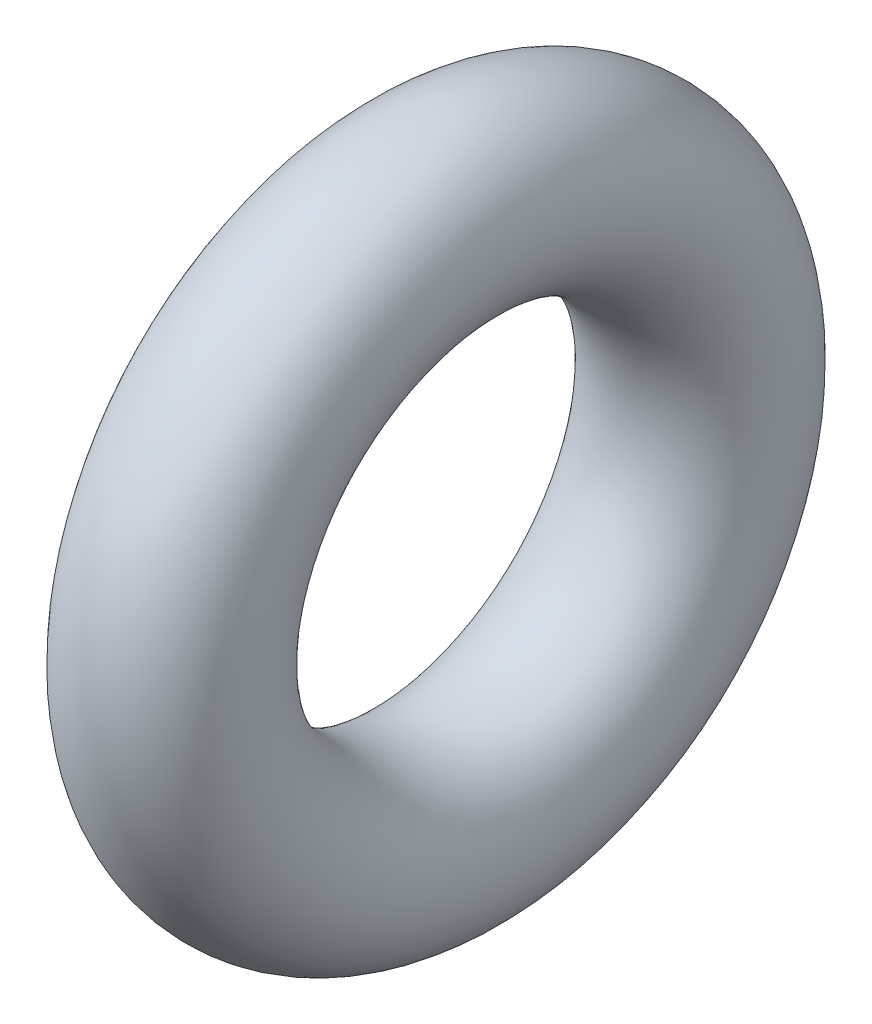
ISO-10303-21;
HEADER;
FILE_DESCRIPTION(('STEP AP214'),'2;1');
FILE_NAME('part.step','',(''),(''),'','','');
FILE_SCHEMA(('AUTOMOTIVE_DESIGN { 1 0 10303 214 1 1 1 1 }'));
ENDSEC;
DATA;
#1=APPLICATION_CONTEXT('core data for automotive mechanical design processes');
#2=APPLICATION_PROTOCOL_DEFINITION('international standard','automotive_design',2000,#1);
#3=PRODUCT_CONTEXT('',#1,'mechanical');
#4=PRODUCT('Part','Part','',(#3));
#5=PRODUCT_RELATED_PRODUCT_CATEGORY('part','',(#4));
#6=PRODUCT_DEFINITION_FORMATION('','',#4);
#7=PRODUCT_DEFINITION_CONTEXT('part definition',#1,'design');
#8=PRODUCT_DEFINITION('design','',#6,#7);
#9=PRODUCT_DEFINITION_SHAPE('','',#8);
#10=(LENGTH_UNIT() NAMED_UNIT(*) SI_UNIT(.MILLI.,.METRE.));
#11=(NAMED_UNIT(*) PLANE_ANGLE_UNIT() SI_UNIT($,.RADIAN.));
#12=(NAMED_UNIT(*) SI_UNIT($,.STERADIAN.) SOLID_ANGLE_UNIT());
#13=UNCERTAINTY_MEASURE_WITH_UNIT(LENGTH_MEASURE(1.E-05),#10,'distance_accuracy_value','');
#14=(GEOMETRIC_REPRESENTATION_CONTEXT(3) GLOBAL_UNCERTAINTY_ASSIGNED_CONTEXT((#13)) GLOBAL_UNIT_ASSIGNED_CONTEXT((#10,
#11,#12)) REPRESENTATION_CONTEXT('',''));
#15=CARTESIAN_POINT('',(0.,0.,0.));
#16=DIRECTION('',(0.,0.,1.));
#17=DIRECTION('',(1.,0.,0.));
#18=AXIS2_PLACEMENT_3D('',#15,#16,#17);
#19=CARTESIAN_POINT('',(0.,0.,0.));
#20=DIRECTION('',(-1.,0.,0.));
#21=DIRECTION('',(0.,0.,1.));
#22=AXIS2_PLACEMENT_3D('',#19,#20,#21);
#23=TOROIDAL_SURFACE('',#22,3.93,1.315);
#24=CARTESIAN_POINT('',(0.,0.,5.245));
#25=VERTEX_POINT('',#24);
#26=VERTEX_LOOP('',#25);
#27=FACE_BOUND('',#26,.T.);
#28=ADVANCED_FACE('F30',(#27),#23,.T.);
#29=CLOSED_SHELL('',(#28));
#30=MANIFOLD_SOLID_BREP('B2',#29);
#31=ADVANCED_BREP_SHAPE_REPRESENTATION('',(#18,#30),#14);
#32=SHAPE_DEFINITION_REPRESENTATION(#9,#31);
ENDSEC;
END-ISO-10303-21;
